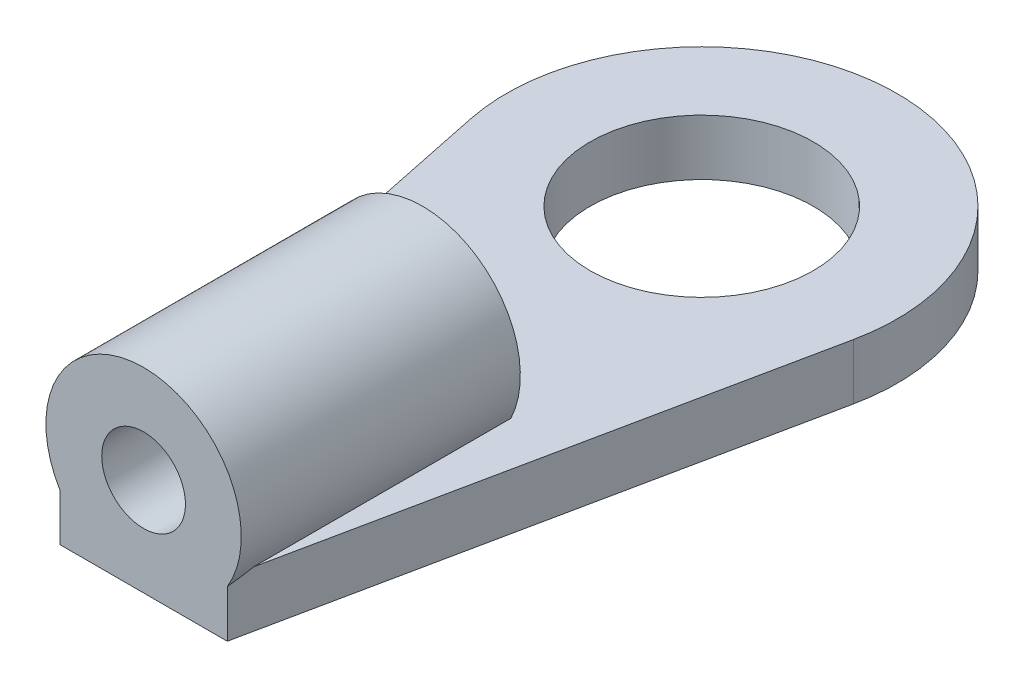
ISO-10303-21;
HEADER;
FILE_DESCRIPTION(('STEP AP214'),'2;1');
FILE_NAME('part.step','',(''),(''),'','','');
FILE_SCHEMA(('AUTOMOTIVE_DESIGN { 1 0 10303 214 1 1 1 1 }'));
ENDSEC;
DATA;
#1=APPLICATION_CONTEXT('core data for automotive mechanical design processes');
#2=APPLICATION_PROTOCOL_DEFINITION('international standard','automotive_design',2000,#1);
#3=PRODUCT_CONTEXT('',#1,'mechanical');
#4=PRODUCT('Part','Part','',(#3));
#5=PRODUCT_RELATED_PRODUCT_CATEGORY('part','',(#4));
#6=PRODUCT_DEFINITION_FORMATION('','',#4);
#7=PRODUCT_DEFINITION_CONTEXT('part definition',#1,'design');
#8=PRODUCT_DEFINITION('design','',#6,#7);
#9=PRODUCT_DEFINITION_SHAPE('','',#8);
#10=(LENGTH_UNIT() NAMED_UNIT(*) SI_UNIT(.MILLI.,.METRE.));
#11=(NAMED_UNIT(*) PLANE_ANGLE_UNIT() SI_UNIT($,.RADIAN.));
#12=(NAMED_UNIT(*) SI_UNIT($,.STERADIAN.) SOLID_ANGLE_UNIT());
#13=UNCERTAINTY_MEASURE_WITH_UNIT(LENGTH_MEASURE(1.E-05),#10,'distance_accuracy_value','');
#14=(GEOMETRIC_REPRESENTATION_CONTEXT(3) GLOBAL_UNCERTAINTY_ASSIGNED_CONTEXT((#13)) GLOBAL_UNIT_ASSIGNED_CONTEXT((#10,
#11,#12)) REPRESENTATION_CONTEXT('',''));
#15=CARTESIAN_POINT('',(0.,0.,0.));
#16=DIRECTION('',(0.,0.,1.));
#17=DIRECTION('',(1.,0.,0.));
#18=AXIS2_PLACEMENT_3D('',#15,#16,#17);
#19=CARTESIAN_POINT('',(0.,1.,0.));
#20=DIRECTION('',(0.,1.,0.));
#21=DIRECTION('',(0.,0.,1.));
#22=AXIS2_PLACEMENT_3D('',#19,#20,#21);
#23=PLANE('',#22);
#24=DIRECTION('',(0.,0.,1.));
#25=VECTOR('',#24,1.);
#26=CARTESIAN_POINT('',(-1.58113883008419,1.,5.));
#27=LINE('',#26,#25);
#28=CARTESIAN_POINT('',(-1.58113883008419,1.,5.));
#29=VERTEX_POINT('',#28);
#30=CARTESIAN_POINT('',(-1.58113883008419,1.,9.60887906963891));
#31=VERTEX_POINT('',#30);
#32=EDGE_CURVE('E123',#29,#31,#27,.T.);
#33=ORIENTED_EDGE('',*,*,#32,.F.);
#34=DIRECTION('',(1.,0.,0.));
#35=VECTOR('',#34,1.);
#36=CARTESIAN_POINT('',(0.,1.,5.));
#37=LINE('',#36,#35);
#38=CARTESIAN_POINT('',(0.,1.,5.));
#39=VERTEX_POINT('',#38);
#40=EDGE_CURVE('E125',#29,#39,#37,.T.);
#41=ORIENTED_EDGE('',*,*,#40,.T.);
#42=CARTESIAN_POINT('',(1.58113883008419,1.,5.));
#43=VERTEX_POINT('',#42);
#44=EDGE_CURVE('E54',#39,#43,#37,.T.);
#45=ORIENTED_EDGE('',*,*,#44,.T.);
#46=DIRECTION('',(0.,0.,1.));
#47=VECTOR('',#46,1.);
#48=CARTESIAN_POINT('',(1.58113883008419,1.,5.));
#49=LINE('',#48,#47);
#50=CARTESIAN_POINT('',(1.58113883008419,1.,9.60887906963892));
#51=VERTEX_POINT('',#50);
#52=EDGE_CURVE('E115',#51,#43,#49,.F.);
#53=ORIENTED_EDGE('',*,*,#52,.F.);
#54=DIRECTION('',(0.203127144540267,0.,-0.979152369731554));
#55=VECTOR('',#54,1.);
#56=CARTESIAN_POINT('',(1.5,1.,10.));
#57=LINE('',#56,#55);
#58=CARTESIAN_POINT('',(3.42703329406044,1.,0.710945005890933));
#59=VERTEX_POINT('',#58);
#60=EDGE_CURVE('E105',#51,#59,#57,.T.);
#61=ORIENTED_EDGE('',*,*,#60,.T.);
#62=CARTESIAN_POINT('',(0.,1.,0.));
#63=DIRECTION('',(0.,1.,0.));
#64=DIRECTION('',(0.,0.,1.));
#65=AXIS2_PLACEMENT_3D('',#62,#63,#64);
#66=CIRCLE('',#65,3.5);
#67=CARTESIAN_POINT('',(-3.42703329406044,1.,0.710945005890935));
#68=VERTEX_POINT('',#67);
#69=EDGE_CURVE('E134',#59,#68,#66,.T.);
#70=ORIENTED_EDGE('',*,*,#69,.T.);
#71=DIRECTION('',(0.203127144540267,0.,0.979152369731554));
#72=VECTOR('',#71,1.);
#73=CARTESIAN_POINT('',(-1.5,1.,10.));
#74=LINE('',#73,#72);
#75=EDGE_CURVE('E137',#68,#31,#74,.T.);
#76=ORIENTED_EDGE('',*,*,#75,.T.);
#77=EDGE_LOOP('',(#33,#41,#45,#53,#61,#70,#76));
#78=FACE_BOUND('',#77,.T.);
#79=CARTESIAN_POINT('',(0.,1.,0.));
#80=DIRECTION('',(0.,1.,0.));
#81=DIRECTION('',(0.,0.,1.));
#82=AXIS2_PLACEMENT_3D('',#79,#80,#81);
#83=CIRCLE('',#82,2.);
#84=CARTESIAN_POINT('',(0.,1.,2.));
#85=VERTEX_POINT('',#84);
#86=EDGE_CURVE('E128',#85,#85,#83,.T.);
#87=ORIENTED_EDGE('',*,*,#86,.F.);
#88=EDGE_LOOP('',(#87));
#89=FACE_BOUND('',#88,.T.);
#90=ADVANCED_FACE('F34',(#78,#89),#23,.T.);
#91=CARTESIAN_POINT('',(0.,0.,0.));
#92=DIRECTION('',(0.,1.,0.));
#93=DIRECTION('',(0.,0.,1.));
#94=AXIS2_PLACEMENT_3D('',#91,#92,#93);
#95=PLANE('',#94);
#96=DIRECTION('',(0.203127144540267,0.,-0.979152369731554));
#97=VECTOR('',#96,1.);
#98=CARTESIAN_POINT('',(1.5,0.,10.));
#99=LINE('',#98,#97);
#100=CARTESIAN_POINT('',(1.5,0.,10.));
#101=VERTEX_POINT('',#100);
#102=CARTESIAN_POINT('',(3.42703329406044,0.,0.710945005890933));
#103=VERTEX_POINT('',#102);
#104=EDGE_CURVE('E138',#101,#103,#99,.T.);
#105=ORIENTED_EDGE('',*,*,#104,.F.);
#106=DIRECTION('',(1.,0.,0.));
#107=VECTOR('',#106,1.);
#108=CARTESIAN_POINT('',(-1.5,0.,10.));
#109=LINE('',#108,#107);
#110=CARTESIAN_POINT('',(-1.5,0.,10.));
#111=VERTEX_POINT('',#110);
#112=EDGE_CURVE('E95',#111,#101,#109,.T.);
#113=ORIENTED_EDGE('',*,*,#112,.F.);
#114=DIRECTION('',(0.203127144540267,0.,0.979152369731554));
#115=VECTOR('',#114,1.);
#116=CARTESIAN_POINT('',(-1.5,0.,10.));
#117=LINE('',#116,#115);
#118=CARTESIAN_POINT('',(-3.42703329406044,0.,0.710945005890935));
#119=VERTEX_POINT('',#118);
#120=EDGE_CURVE('E144',#119,#111,#117,.T.);
#121=ORIENTED_EDGE('',*,*,#120,.F.);
#122=CARTESIAN_POINT('',(0.,0.,0.));
#123=DIRECTION('',(0.,1.,0.));
#124=DIRECTION('',(0.,0.,1.));
#125=AXIS2_PLACEMENT_3D('',#122,#123,#124);
#126=CIRCLE('',#125,3.5);
#127=EDGE_CURVE('E131',#103,#119,#126,.T.);
#128=ORIENTED_EDGE('',*,*,#127,.F.);
#129=EDGE_LOOP('',(#105,#113,#121,#128));
#130=FACE_BOUND('',#129,.T.);
#131=CARTESIAN_POINT('',(0.,0.,0.));
#132=DIRECTION('',(0.,1.,0.));
#133=DIRECTION('',(0.,0.,1.));
#134=AXIS2_PLACEMENT_3D('',#131,#132,#133);
#135=CIRCLE('',#134,2.);
#136=CARTESIAN_POINT('',(0.,0.,2.));
#137=VERTEX_POINT('',#136);
#138=EDGE_CURVE('E127',#137,#137,#135,.T.);
#139=ORIENTED_EDGE('',*,*,#138,.T.);
#140=EDGE_LOOP('',(#139));
#141=FACE_BOUND('',#140,.T.);
#142=ADVANCED_FACE('F159',(#130,#141),#95,.F.);
#143=CARTESIAN_POINT('',(0.,1.,0.));
#144=DIRECTION('',(0.,-1.,0.));
#145=DIRECTION('',(0.,0.,-1.));
#146=AXIS2_PLACEMENT_3D('',#143,#144,#145);
#147=CYLINDRICAL_SURFACE('',#146,3.5);
#148=ORIENTED_EDGE('',*,*,#127,.T.);
#149=DIRECTION('',(0.,-1.,0.));
#150=VECTOR('',#149,1.);
#151=CARTESIAN_POINT('',(-3.42703329406044,1.,0.710945005890935));
#152=LINE('',#151,#150);
#153=EDGE_CURVE('E42',#68,#119,#152,.T.);
#154=ORIENTED_EDGE('',*,*,#153,.F.);
#155=ORIENTED_EDGE('',*,*,#69,.F.);
#156=DIRECTION('',(0.,-1.,0.));
#157=VECTOR('',#156,1.);
#158=CARTESIAN_POINT('',(3.42703329406044,1.,0.710945005890933));
#159=LINE('',#158,#157);
#160=EDGE_CURVE('E99',#59,#103,#159,.T.);
#161=ORIENTED_EDGE('',*,*,#160,.T.);
#162=EDGE_LOOP('',(#148,#154,#155,#161));
#163=FACE_BOUND('',#162,.T.);
#164=ADVANCED_FACE('F36',(#163),#147,.T.);
#165=CARTESIAN_POINT('',(-1.5,1.,10.));
#166=DIRECTION('',(0.979152369731554,0.,-0.203127144540267));
#167=DIRECTION('',(-0.203127144540267,0.,-0.979152369731554));
#168=AXIS2_PLACEMENT_3D('',#165,#166,#167);
#169=PLANE('',#168);
#170=DIRECTION('',(0.,-1.,0.));
#171=VECTOR('',#170,1.);
#172=CARTESIAN_POINT('',(-1.5,1.,10.));
#173=LINE('',#172,#171);
#174=CARTESIAN_POINT('',(-1.5,0.848612181134,10.));
#175=VERTEX_POINT('',#174);
#176=EDGE_CURVE('E98',#175,#111,#173,.T.);
#177=ORIENTED_EDGE('',*,*,#176,.F.);
#178=CARTESIAN_POINT('',(0.,1.75,17.2305873147652));
#179=DIRECTION('',(0.979152369731554,0.,-0.203127144540267));
#180=DIRECTION('',(0.203127144540267,0.,0.979152369731554));
#181=AXIS2_PLACEMENT_3D('',#178,#179,#180);
#182=ELLIPSE('',#181,8.6152936573826,1.75);
#183=EDGE_CURVE('E111',#175,#31,#182,.T.);
#184=ORIENTED_EDGE('',*,*,#183,.T.);
#185=ORIENTED_EDGE('',*,*,#75,.F.);
#186=ORIENTED_EDGE('',*,*,#153,.T.);
#187=ORIENTED_EDGE('',*,*,#120,.T.);
#188=EDGE_LOOP('',(#177,#184,#185,#186,#187));
#189=FACE_BOUND('',#188,.T.);
#190=ADVANCED_FACE('F154',(#189),#169,.F.);
#191=CARTESIAN_POINT('',(-1.5,1.,10.));
#192=DIRECTION('',(0.,0.,-1.));
#193=DIRECTION('',(-1.,0.,0.));
#194=AXIS2_PLACEMENT_3D('',#191,#192,#193);
#195=PLANE('',#194);
#196=CARTESIAN_POINT('',(0.,1.75,10.));
#197=DIRECTION('',(0.,0.,-1.));
#198=DIRECTION('',(-1.,0.,0.));
#199=AXIS2_PLACEMENT_3D('',#196,#197,#198);
#200=CIRCLE('',#199,0.75);
#201=CARTESIAN_POINT('',(-0.75,1.75,10.));
#202=VERTEX_POINT('',#201);
#203=EDGE_CURVE('E113',#202,#202,#200,.T.);
#204=ORIENTED_EDGE('',*,*,#203,.T.);
#205=EDGE_LOOP('',(#204));
#206=FACE_BOUND('',#205,.T.);
#207=CARTESIAN_POINT('',(0.,1.75,10.));
#208=DIRECTION('',(0.,0.,1.));
#209=DIRECTION('',(1.,0.,0.));
#210=AXIS2_PLACEMENT_3D('',#207,#208,#209);
#211=CIRCLE('',#210,1.75);
#212=CARTESIAN_POINT('',(1.5,0.848612181134005,10.));
#213=VERTEX_POINT('',#212);
#214=EDGE_CURVE('E93',#213,#175,#211,.T.);
#215=ORIENTED_EDGE('',*,*,#214,.T.);
#216=ORIENTED_EDGE('',*,*,#176,.T.);
#217=ORIENTED_EDGE('',*,*,#112,.T.);
#218=DIRECTION('',(0.,-1.,0.));
#219=VECTOR('',#218,1.);
#220=CARTESIAN_POINT('',(1.5,1.,10.));
#221=LINE('',#220,#219);
#222=EDGE_CURVE('E90',#213,#101,#221,.T.);
#223=ORIENTED_EDGE('',*,*,#222,.F.);
#224=EDGE_LOOP('',(#215,#216,#217,#223));
#225=FACE_BOUND('',#224,.T.);
#226=ADVANCED_FACE('F91',(#206,#225),#195,.F.);
#227=CARTESIAN_POINT('',(1.5,1.,10.));
#228=DIRECTION('',(-0.979152369731554,0.,-0.203127144540267));
#229=DIRECTION('',(-0.203127144540267,0.,0.979152369731554));
#230=AXIS2_PLACEMENT_3D('',#227,#228,#229);
#231=PLANE('',#230);
#232=ORIENTED_EDGE('',*,*,#60,.F.);
#233=CARTESIAN_POINT('',(0.,1.75,17.2305873147652));
#234=DIRECTION('',(-0.979152369731554,0.,-0.203127144540267));
#235=DIRECTION('',(-0.203127144540267,0.,0.979152369731554));
#236=AXIS2_PLACEMENT_3D('',#233,#234,#235);
#237=ELLIPSE('',#236,8.61529365738262,1.75);
#238=EDGE_CURVE('E11',#51,#213,#237,.T.);
#239=ORIENTED_EDGE('',*,*,#238,.T.);
#240=ORIENTED_EDGE('',*,*,#222,.T.);
#241=ORIENTED_EDGE('',*,*,#104,.T.);
#242=ORIENTED_EDGE('',*,*,#160,.F.);
#243=EDGE_LOOP('',(#232,#239,#240,#241,#242));
#244=FACE_BOUND('',#243,.T.);
#245=ADVANCED_FACE('F103',(#244),#231,.F.);
#246=CARTESIAN_POINT('',(0.,1.,0.));
#247=DIRECTION('',(0.,-1.,0.));
#248=DIRECTION('',(0.,0.,-1.));
#249=AXIS2_PLACEMENT_3D('',#246,#247,#248);
#250=CYLINDRICAL_SURFACE('',#249,2.);
#251=ORIENTED_EDGE('',*,*,#86,.T.);
#252=EDGE_LOOP('',(#251));
#253=FACE_BOUND('',#252,.T.);
#254=ORIENTED_EDGE('',*,*,#138,.F.);
#255=EDGE_LOOP('',(#254));
#256=FACE_BOUND('',#255,.T.);
#257=ADVANCED_FACE('F175',(#253,#256),#250,.F.);
#258=CARTESIAN_POINT('',(0.,1.75,5.));
#259=DIRECTION('',(0.,0.,1.));
#260=DIRECTION('',(1.,0.,0.));
#261=AXIS2_PLACEMENT_3D('',#258,#259,#260);
#262=CYLINDRICAL_SURFACE('',#261,1.75);
#263=CARTESIAN_POINT('',(0.,1.75,5.));
#264=DIRECTION('',(0.,0.,1.));
#265=DIRECTION('',(1.,0.,0.));
#266=AXIS2_PLACEMENT_3D('',#263,#264,#265);
#267=CIRCLE('',#266,1.75);
#268=EDGE_CURVE('E112',#43,#29,#267,.T.);
#269=ORIENTED_EDGE('',*,*,#268,.T.);
#270=ORIENTED_EDGE('',*,*,#32,.T.);
#271=ORIENTED_EDGE('',*,*,#183,.F.);
#272=ORIENTED_EDGE('',*,*,#214,.F.);
#273=ORIENTED_EDGE('',*,*,#238,.F.);
#274=ORIENTED_EDGE('',*,*,#52,.T.);
#275=EDGE_LOOP('',(#269,#270,#271,#272,#273,#274));
#276=FACE_BOUND('',#275,.T.);
#277=ADVANCED_FACE('F109',(#276),#262,.T.);
#278=CARTESIAN_POINT('',(0.,1.75,5.));
#279=DIRECTION('',(0.,0.,1.));
#280=DIRECTION('',(1.,0.,0.));
#281=AXIS2_PLACEMENT_3D('',#278,#279,#280);
#282=PLANE('',#281);
#283=ORIENTED_EDGE('',*,*,#44,.F.);
#284=CARTESIAN_POINT('',(0.,1.75,5.));
#285=DIRECTION('',(0.,0.,-1.));
#286=DIRECTION('',(-1.,0.,0.));
#287=AXIS2_PLACEMENT_3D('',#284,#285,#286);
#288=CIRCLE('',#287,0.75);
#289=EDGE_CURVE('E47',#39,#39,#288,.T.);
#290=ORIENTED_EDGE('',*,*,#289,.F.);
#291=ORIENTED_EDGE('',*,*,#40,.F.);
#292=ORIENTED_EDGE('',*,*,#268,.F.);
#293=EDGE_LOOP('',(#283,#290,#291,#292));
#294=FACE_BOUND('',#293,.T.);
#295=ADVANCED_FACE('F165',(#294),#282,.F.);
#296=CARTESIAN_POINT('',(0.,1.75,10.));
#297=DIRECTION('',(0.,0.,-1.));
#298=DIRECTION('',(-1.,0.,0.));
#299=AXIS2_PLACEMENT_3D('',#296,#297,#298);
#300=CYLINDRICAL_SURFACE('',#299,0.75);
#301=ORIENTED_EDGE('',*,*,#203,.F.);
#302=EDGE_LOOP('',(#301));
#303=FACE_BOUND('',#302,.T.);
#304=ORIENTED_EDGE('',*,*,#289,.T.);
#305=EDGE_LOOP('',(#304));
#306=FACE_BOUND('',#305,.T.);
#307=ADVANCED_FACE('F167',(#303,#306),#300,.F.);
#308=CLOSED_SHELL('',(#90,#142,#164,#190,#226,#245,#257,#277,#295,#307));
#309=MANIFOLD_SOLID_BREP('B2',#308);
#310=ADVANCED_BREP_SHAPE_REPRESENTATION('',(#18,#309),#14);
#311=SHAPE_DEFINITION_REPRESENTATION(#9,#310);
ENDSEC;
END-ISO-10303-21;
